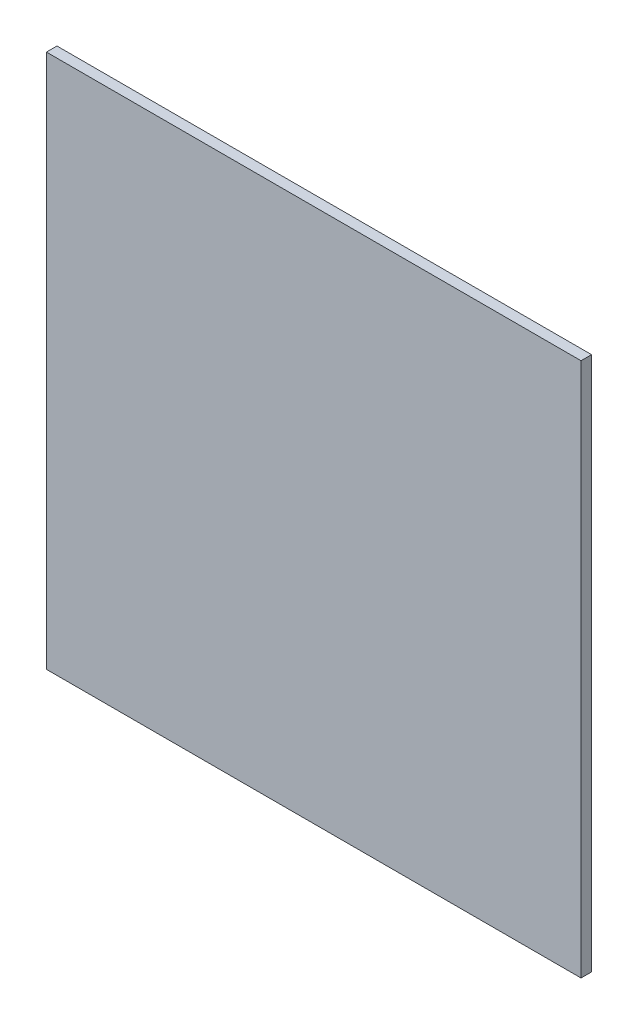
ISO-10303-21;
HEADER;
FILE_DESCRIPTION(('STEP AP214'),'2;1');
FILE_NAME('part.step','',(''),(''),'','','');
FILE_SCHEMA(('AUTOMOTIVE_DESIGN { 1 0 10303 214 1 1 1 1 }'));
ENDSEC;
DATA;
#1=APPLICATION_CONTEXT('core data for automotive mechanical design processes');
#2=APPLICATION_PROTOCOL_DEFINITION('international standard','automotive_design',2000,#1);
#3=PRODUCT_CONTEXT('',#1,'mechanical');
#4=PRODUCT('Part','Part','',(#3));
#5=PRODUCT_RELATED_PRODUCT_CATEGORY('part','',(#4));
#6=PRODUCT_DEFINITION_FORMATION('','',#4);
#7=PRODUCT_DEFINITION_CONTEXT('part definition',#1,'design');
#8=PRODUCT_DEFINITION('design','',#6,#7);
#9=PRODUCT_DEFINITION_SHAPE('','',#8);
#10=(LENGTH_UNIT() NAMED_UNIT(*) SI_UNIT(.MILLI.,.METRE.));
#11=(NAMED_UNIT(*) PLANE_ANGLE_UNIT() SI_UNIT($,.RADIAN.));
#12=(NAMED_UNIT(*) SI_UNIT($,.STERADIAN.) SOLID_ANGLE_UNIT());
#13=UNCERTAINTY_MEASURE_WITH_UNIT(LENGTH_MEASURE(1.E-05),#10,'distance_accuracy_value','');
#14=(GEOMETRIC_REPRESENTATION_CONTEXT(3) GLOBAL_UNCERTAINTY_ASSIGNED_CONTEXT((#13)) GLOBAL_UNIT_ASSIGNED_CONTEXT((#10,
#11,#12)) REPRESENTATION_CONTEXT('',''));
#15=CARTESIAN_POINT('',(0.,0.,0.));
#16=DIRECTION('',(0.,0.,1.));
#17=DIRECTION('',(1.,0.,0.));
#18=AXIS2_PLACEMENT_3D('',#15,#16,#17);
#19=CARTESIAN_POINT('',(38.1,-38.1,1.5));
#20=DIRECTION('',(-1.,0.,0.));
#21=DIRECTION('',(0.,0.,1.));
#22=AXIS2_PLACEMENT_3D('',#19,#20,#21);
#23=PLANE('',#22);
#24=DIRECTION('',(0.,1.,0.));
#25=VECTOR('',#24,1.);
#26=CARTESIAN_POINT('',(38.1,-38.1,0.));
#27=LINE('',#26,#25);
#28=CARTESIAN_POINT('',(38.1,-38.1,0.));
#29=VERTEX_POINT('',#28);
#30=CARTESIAN_POINT('',(38.1,38.1,0.));
#31=VERTEX_POINT('',#30);
#32=EDGE_CURVE('E89',#29,#31,#27,.T.);
#33=ORIENTED_EDGE('',*,*,#32,.T.);
#34=DIRECTION('',(0.,0.,-1.));
#35=VECTOR('',#34,1.);
#36=CARTESIAN_POINT('',(38.1,38.1,1.5));
#37=LINE('',#36,#35);
#38=CARTESIAN_POINT('',(38.1,38.1,1.5));
#39=VERTEX_POINT('',#38);
#40=EDGE_CURVE('E12',#39,#31,#37,.T.);
#41=ORIENTED_EDGE('',*,*,#40,.F.);
#42=DIRECTION('',(0.,1.,0.));
#43=VECTOR('',#42,1.);
#44=CARTESIAN_POINT('',(38.1,-38.1,1.5));
#45=LINE('',#44,#43);
#46=CARTESIAN_POINT('',(38.1,-38.1,1.5));
#47=VERTEX_POINT('',#46);
#48=EDGE_CURVE('E71',#47,#39,#45,.T.);
#49=ORIENTED_EDGE('',*,*,#48,.F.);
#50=DIRECTION('',(0.,0.,-1.));
#51=VECTOR('',#50,1.);
#52=CARTESIAN_POINT('',(38.1,-38.1,1.5));
#53=LINE('',#52,#51);
#54=EDGE_CURVE('E86',#47,#29,#53,.T.);
#55=ORIENTED_EDGE('',*,*,#54,.T.);
#56=EDGE_LOOP('',(#33,#41,#49,#55));
#57=FACE_BOUND('',#56,.T.);
#58=ADVANCED_FACE('F19',(#57),#23,.F.);
#59=CARTESIAN_POINT('',(-38.1,38.1,1.5));
#60=DIRECTION('',(0.,-1.,0.));
#61=DIRECTION('',(0.,0.,-1.));
#62=AXIS2_PLACEMENT_3D('',#59,#60,#61);
#63=PLANE('',#62);
#64=DIRECTION('',(-1.,0.,0.));
#65=VECTOR('',#64,1.);
#66=CARTESIAN_POINT('',(-38.1,38.1,0.));
#67=LINE('',#66,#65);
#68=CARTESIAN_POINT('',(-38.1,38.1,0.));
#69=VERTEX_POINT('',#68);
#70=EDGE_CURVE('E76',#31,#69,#67,.T.);
#71=ORIENTED_EDGE('',*,*,#70,.T.);
#72=DIRECTION('',(0.,0.,-1.));
#73=VECTOR('',#72,1.);
#74=CARTESIAN_POINT('',(-38.1,38.1,1.5));
#75=LINE('',#74,#73);
#76=CARTESIAN_POINT('',(-38.1,38.1,1.5));
#77=VERTEX_POINT('',#76);
#78=EDGE_CURVE('E28',#77,#69,#75,.T.);
#79=ORIENTED_EDGE('',*,*,#78,.F.);
#80=DIRECTION('',(-1.,0.,0.));
#81=VECTOR('',#80,1.);
#82=CARTESIAN_POINT('',(-38.1,38.1,1.5));
#83=LINE('',#82,#81);
#84=EDGE_CURVE('E66',#39,#77,#83,.T.);
#85=ORIENTED_EDGE('',*,*,#84,.F.);
#86=ORIENTED_EDGE('',*,*,#40,.T.);
#87=EDGE_LOOP('',(#71,#79,#85,#86));
#88=FACE_BOUND('',#87,.T.);
#89=ADVANCED_FACE('F75',(#88),#63,.F.);
#90=CARTESIAN_POINT('',(-38.1,-38.1,1.5));
#91=DIRECTION('',(1.,0.,0.));
#92=DIRECTION('',(0.,0.,-1.));
#93=AXIS2_PLACEMENT_3D('',#90,#91,#92);
#94=PLANE('',#93);
#95=DIRECTION('',(0.,-1.,0.));
#96=VECTOR('',#95,1.);
#97=CARTESIAN_POINT('',(-38.1,-38.1,0.));
#98=LINE('',#97,#96);
#99=CARTESIAN_POINT('',(-38.1,-38.1,0.));
#100=VERTEX_POINT('',#99);
#101=EDGE_CURVE('E53',#69,#100,#98,.T.);
#102=ORIENTED_EDGE('',*,*,#101,.T.);
#103=DIRECTION('',(0.,0.,-1.));
#104=VECTOR('',#103,1.);
#105=CARTESIAN_POINT('',(-38.1,-38.1,1.5));
#106=LINE('',#105,#104);
#107=CARTESIAN_POINT('',(-38.1,-38.1,1.5));
#108=VERTEX_POINT('',#107);
#109=EDGE_CURVE('E78',#108,#100,#106,.T.);
#110=ORIENTED_EDGE('',*,*,#109,.F.);
#111=DIRECTION('',(0.,-1.,0.));
#112=VECTOR('',#111,1.);
#113=CARTESIAN_POINT('',(-38.1,-38.1,1.5));
#114=LINE('',#113,#112);
#115=EDGE_CURVE('E69',#77,#108,#114,.T.);
#116=ORIENTED_EDGE('',*,*,#115,.F.);
#117=ORIENTED_EDGE('',*,*,#78,.T.);
#118=EDGE_LOOP('',(#102,#110,#116,#117));
#119=FACE_BOUND('',#118,.T.);
#120=ADVANCED_FACE('F79',(#119),#94,.F.);
#121=CARTESIAN_POINT('',(-38.1,-38.1,1.5));
#122=DIRECTION('',(0.,1.,0.));
#123=DIRECTION('',(0.,0.,1.));
#124=AXIS2_PLACEMENT_3D('',#121,#122,#123);
#125=PLANE('',#124);
#126=DIRECTION('',(1.,0.,0.));
#127=VECTOR('',#126,1.);
#128=CARTESIAN_POINT('',(-38.1,-38.1,0.));
#129=LINE('',#128,#127);
#130=EDGE_CURVE('E59',#100,#29,#129,.T.);
#131=ORIENTED_EDGE('',*,*,#130,.T.);
#132=ORIENTED_EDGE('',*,*,#54,.F.);
#133=DIRECTION('',(1.,0.,0.));
#134=VECTOR('',#133,1.);
#135=CARTESIAN_POINT('',(-38.1,-38.1,1.5));
#136=LINE('',#135,#134);
#137=EDGE_CURVE('E36',#108,#47,#136,.T.);
#138=ORIENTED_EDGE('',*,*,#137,.F.);
#139=ORIENTED_EDGE('',*,*,#109,.T.);
#140=EDGE_LOOP('',(#131,#132,#138,#139));
#141=FACE_BOUND('',#140,.T.);
#142=ADVANCED_FACE('F110',(#141),#125,.F.);
#143=CARTESIAN_POINT('',(0.,0.,1.5));
#144=DIRECTION('',(0.,0.,-1.));
#145=DIRECTION('',(-1.,0.,0.));
#146=AXIS2_PLACEMENT_3D('',#143,#144,#145);
#147=PLANE('',#146);
#148=ORIENTED_EDGE('',*,*,#48,.T.);
#149=ORIENTED_EDGE('',*,*,#84,.T.);
#150=ORIENTED_EDGE('',*,*,#115,.T.);
#151=ORIENTED_EDGE('',*,*,#137,.T.);
#152=EDGE_LOOP('',(#148,#149,#150,#151));
#153=FACE_BOUND('',#152,.T.);
#154=ADVANCED_FACE('F67',(#153),#147,.F.);
#155=CARTESIAN_POINT('',(0.,0.,0.));
#156=DIRECTION('',(0.,0.,-1.));
#157=DIRECTION('',(-1.,0.,0.));
#158=AXIS2_PLACEMENT_3D('',#155,#156,#157);
#159=PLANE('',#158);
#160=ORIENTED_EDGE('',*,*,#32,.F.);
#161=ORIENTED_EDGE('',*,*,#130,.F.);
#162=ORIENTED_EDGE('',*,*,#101,.F.);
#163=ORIENTED_EDGE('',*,*,#70,.F.);
#164=EDGE_LOOP('',(#160,#161,#162,#163));
#165=FACE_BOUND('',#164,.T.);
#166=ADVANCED_FACE('F113',(#165),#159,.T.);
#167=CLOSED_SHELL('',(#58,#89,#120,#142,#154,#166));
#168=MANIFOLD_SOLID_BREP('B1',#167);
#169=ADVANCED_BREP_SHAPE_REPRESENTATION('',(#18,#168),#14);
#170=SHAPE_DEFINITION_REPRESENTATION(#9,#169);
ENDSEC;
END-ISO-10303-21;
